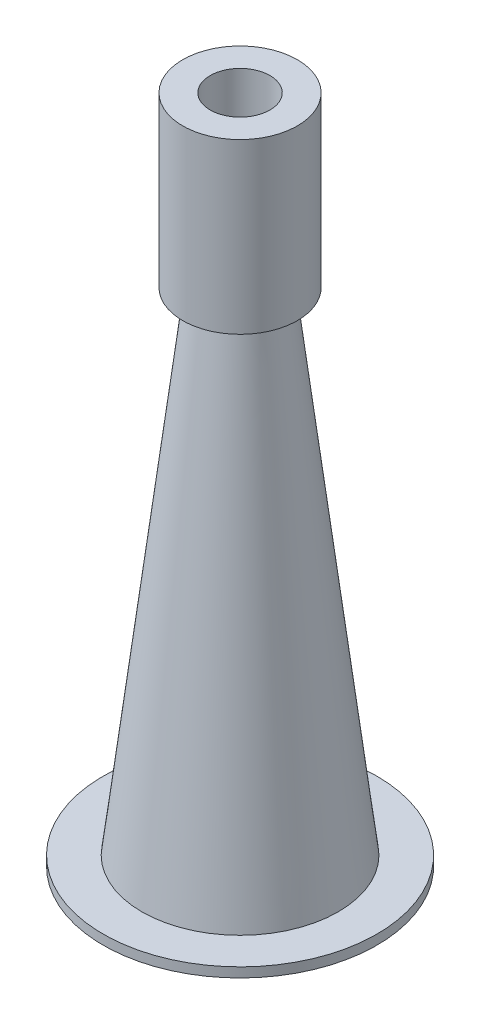
ISO-10303-21;
HEADER;
FILE_DESCRIPTION(('STEP AP214'),'2;1');
FILE_NAME('part.step','',(''),(''),'','','');
FILE_SCHEMA(('AUTOMOTIVE_DESIGN { 1 0 10303 214 1 1 1 1 }'));
ENDSEC;
DATA;
#1=APPLICATION_CONTEXT('core data for automotive mechanical design processes');
#2=APPLICATION_PROTOCOL_DEFINITION('international standard','automotive_design',2000,#1);
#3=PRODUCT_CONTEXT('',#1,'mechanical');
#4=PRODUCT('Part','Part','',(#3));
#5=PRODUCT_RELATED_PRODUCT_CATEGORY('part','',(#4));
#6=PRODUCT_DEFINITION_FORMATION('','',#4);
#7=PRODUCT_DEFINITION_CONTEXT('part definition',#1,'design');
#8=PRODUCT_DEFINITION('design','',#6,#7);
#9=PRODUCT_DEFINITION_SHAPE('','',#8);
#10=(LENGTH_UNIT() NAMED_UNIT(*) SI_UNIT(.MILLI.,.METRE.));
#11=(NAMED_UNIT(*) PLANE_ANGLE_UNIT() SI_UNIT($,.RADIAN.));
#12=(NAMED_UNIT(*) SI_UNIT($,.STERADIAN.) SOLID_ANGLE_UNIT());
#13=UNCERTAINTY_MEASURE_WITH_UNIT(LENGTH_MEASURE(1.E-05),#10,'distance_accuracy_value','');
#14=(GEOMETRIC_REPRESENTATION_CONTEXT(3) GLOBAL_UNCERTAINTY_ASSIGNED_CONTEXT((#13)) GLOBAL_UNIT_ASSIGNED_CONTEXT((#10,
#11,#12)) REPRESENTATION_CONTEXT('',''));
#15=CARTESIAN_POINT('',(0.,0.,0.));
#16=DIRECTION('',(0.,0.,1.));
#17=DIRECTION('',(1.,0.,0.));
#18=AXIS2_PLACEMENT_3D('',#15,#16,#17);
#19=CARTESIAN_POINT('',(0.,0.,0.));
#20=DIRECTION('',(0.,-1.,0.));
#21=DIRECTION('',(0.,0.,-1.));
#22=AXIS2_PLACEMENT_3D('',#19,#20,#21);
#23=CYLINDRICAL_SURFACE('',#22,59.4999999999999);
#24=CARTESIAN_POINT('',(0.,695.,0.));
#25=DIRECTION('',(0.,-1.,0.));
#26=DIRECTION('',(0.,0.,-1.));
#27=AXIS2_PLACEMENT_3D('',#24,#25,#26);
#28=CIRCLE('',#27,59.4999999999999);
#29=CARTESIAN_POINT('',(0.,695.,-59.4999999999999));
#30=VERTEX_POINT('',#29);
#31=EDGE_CURVE('E80',#30,#30,#28,.T.);
#32=ORIENTED_EDGE('',*,*,#31,.T.);
#33=EDGE_LOOP('',(#32));
#34=FACE_BOUND('',#33,.T.);
#35=CARTESIAN_POINT('',(0.,520.,0.));
#36=DIRECTION('',(0.,-1.,0.));
#37=DIRECTION('',(0.,0.,-1.));
#38=AXIS2_PLACEMENT_3D('',#35,#36,#37);
#39=CIRCLE('',#38,59.4999999999999);
#40=CARTESIAN_POINT('',(0.,520.,-59.4999999999999));
#41=VERTEX_POINT('',#40);
#42=EDGE_CURVE('E10',#41,#41,#39,.T.);
#43=ORIENTED_EDGE('',*,*,#42,.F.);
#44=EDGE_LOOP('',(#43));
#45=FACE_BOUND('',#44,.T.);
#46=ADVANCED_FACE('F41',(#34,#45),#23,.T.);
#47=CARTESIAN_POINT('',(59.4999999999999,520.,0.));
#48=DIRECTION('',(0.,-1.,0.));
#49=DIRECTION('',(0.,0.,-1.));
#50=AXIS2_PLACEMENT_3D('',#47,#48,#49);
#51=PLANE('',#50);
#52=ORIENTED_EDGE('',*,*,#42,.T.);
#53=EDGE_LOOP('',(#52));
#54=FACE_BOUND('',#53,.T.);
#55=CARTESIAN_POINT('',(0.,520.,0.));
#56=DIRECTION('',(0.,-1.,0.));
#57=DIRECTION('',(0.,0.,-1.));
#58=AXIS2_PLACEMENT_3D('',#55,#56,#57);
#59=CIRCLE('',#58,40.9999999999999);
#60=CARTESIAN_POINT('',(0.,520.,-40.9999999999999));
#61=VERTEX_POINT('',#60);
#62=EDGE_CURVE('E48',#61,#61,#59,.T.);
#63=ORIENTED_EDGE('',*,*,#62,.F.);
#64=EDGE_LOOP('',(#63));
#65=FACE_BOUND('',#64,.T.);
#66=ADVANCED_FACE('F99',(#54,#65),#51,.T.);
#67=CARTESIAN_POINT('',(0.,9.99999999999999,0.));
#68=DIRECTION('',(0.,-1.,0.));
#69=DIRECTION('',(0.,0.,-1.));
#70=AXIS2_PLACEMENT_3D('',#67,#68,#69);
#71=CONICAL_SURFACE('',#70,101.908326060574,0.118865096838854);
#72=ORIENTED_EDGE('',*,*,#62,.T.);
#73=EDGE_LOOP('',(#72));
#74=FACE_BOUND('',#73,.T.);
#75=CARTESIAN_POINT('',(0.,9.99999999999999,0.));
#76=DIRECTION('',(0.,-1.,0.));
#77=DIRECTION('',(0.,0.,-1.));
#78=AXIS2_PLACEMENT_3D('',#75,#76,#77);
#79=CIRCLE('',#78,101.908326060574);
#80=CARTESIAN_POINT('',(0.,9.99999999999999,-101.908326060574));
#81=VERTEX_POINT('',#80);
#82=EDGE_CURVE('E53',#81,#81,#79,.T.);
#83=ORIENTED_EDGE('',*,*,#82,.F.);
#84=EDGE_LOOP('',(#83));
#85=FACE_BOUND('',#84,.T.);
#86=ADVANCED_FACE('F103',(#74,#85),#71,.T.);
#87=CARTESIAN_POINT('',(142.,10.,0.));
#88=DIRECTION('',(0.,1.,0.));
#89=DIRECTION('',(0.,0.,1.));
#90=AXIS2_PLACEMENT_3D('',#87,#88,#89);
#91=PLANE('',#90);
#92=ORIENTED_EDGE('',*,*,#82,.T.);
#93=EDGE_LOOP('',(#92));
#94=FACE_BOUND('',#93,.T.);
#95=CARTESIAN_POINT('',(0.,10.,0.));
#96=DIRECTION('',(0.,-1.,0.));
#97=DIRECTION('',(0.,0.,-1.));
#98=AXIS2_PLACEMENT_3D('',#95,#96,#97);
#99=CIRCLE('',#98,142.);
#100=CARTESIAN_POINT('',(0.,10.,-142.));
#101=VERTEX_POINT('',#100);
#102=EDGE_CURVE('E58',#101,#101,#99,.T.);
#103=ORIENTED_EDGE('',*,*,#102,.F.);
#104=EDGE_LOOP('',(#103));
#105=FACE_BOUND('',#104,.T.);
#106=ADVANCED_FACE('F107',(#94,#105),#91,.T.);
#107=CARTESIAN_POINT('',(0.,0.,0.));
#108=DIRECTION('',(0.,-1.,0.));
#109=DIRECTION('',(0.,0.,-1.));
#110=AXIS2_PLACEMENT_3D('',#107,#108,#109);
#111=CYLINDRICAL_SURFACE('',#110,142.);
#112=ORIENTED_EDGE('',*,*,#102,.T.);
#113=EDGE_LOOP('',(#112));
#114=FACE_BOUND('',#113,.T.);
#115=CARTESIAN_POINT('',(0.,0.,0.));
#116=DIRECTION('',(0.,-1.,0.));
#117=DIRECTION('',(0.,0.,-1.));
#118=AXIS2_PLACEMENT_3D('',#115,#116,#117);
#119=CIRCLE('',#118,142.);
#120=CARTESIAN_POINT('',(0.,0.,-142.));
#121=VERTEX_POINT('',#120);
#122=EDGE_CURVE('E64',#121,#121,#119,.T.);
#123=ORIENTED_EDGE('',*,*,#122,.F.);
#124=EDGE_LOOP('',(#123));
#125=FACE_BOUND('',#124,.T.);
#126=ADVANCED_FACE('F113',(#114,#125),#111,.T.);
#127=CARTESIAN_POINT('',(95.,0.,0.));
#128=DIRECTION('',(0.,-1.,0.));
#129=DIRECTION('',(0.,0.,-1.));
#130=AXIS2_PLACEMENT_3D('',#127,#128,#129);
#131=PLANE('',#130);
#132=ORIENTED_EDGE('',*,*,#122,.T.);
#133=EDGE_LOOP('',(#132));
#134=FACE_BOUND('',#133,.T.);
#135=CARTESIAN_POINT('',(0.,0.,0.));
#136=DIRECTION('',(0.,-1.,0.));
#137=DIRECTION('',(0.,0.,-1.));
#138=AXIS2_PLACEMENT_3D('',#135,#136,#137);
#139=CIRCLE('',#138,95.);
#140=CARTESIAN_POINT('',(0.,0.,-95.));
#141=VERTEX_POINT('',#140);
#142=EDGE_CURVE('E68',#141,#141,#139,.T.);
#143=ORIENTED_EDGE('',*,*,#142,.F.);
#144=EDGE_LOOP('',(#143));
#145=FACE_BOUND('',#144,.T.);
#146=ADVANCED_FACE('F117',(#134,#145),#131,.T.);
#147=CARTESIAN_POINT('',(0.,520.,0.));
#148=DIRECTION('',(0.,-1.,0.));
#149=DIRECTION('',(0.,0.,-1.));
#150=AXIS2_PLACEMENT_3D('',#147,#148,#149);
#151=CONICAL_SURFACE('',#150,30.9999999999999,0.122461057417342);
#152=CARTESIAN_POINT('',(0.,520.,0.));
#153=DIRECTION('',(0.,-1.,0.));
#154=DIRECTION('',(0.,0.,-1.));
#155=AXIS2_PLACEMENT_3D('',#152,#153,#154);
#156=CIRCLE('',#155,30.9999999999999);
#157=CARTESIAN_POINT('',(0.,520.,-30.9999999999999));
#158=VERTEX_POINT('',#157);
#159=EDGE_CURVE('E72',#158,#158,#156,.T.);
#160=CARTESIAN_POINT('',(0.,0.,-95.));
#161=CARTESIAN_POINT('',(0.,5.41666666666667,-94.3333333333334));
#162=CARTESIAN_POINT('',(0.,10.8333333333333,-93.6666666666667));
#163=CARTESIAN_POINT('',(0.,21.6666666666667,-92.3333333333334));
#164=CARTESIAN_POINT('',(0.,27.0833333333333,-91.6666666666667));
#165=CARTESIAN_POINT('',(0.,37.9166666666667,-90.3333333333334));
#166=CARTESIAN_POINT('',(0.,43.3333333333334,-89.6666666666667));
#167=CARTESIAN_POINT('',(0.,54.1666666666667,-88.3333333333334));
#168=CARTESIAN_POINT('',(0.,59.5833333333333,-87.6666666666667));
#169=CARTESIAN_POINT('',(0.,70.4166666666667,-86.3333333333333));
#170=CARTESIAN_POINT('',(0.,75.8333333333334,-85.6666666666667));
#171=CARTESIAN_POINT('',(0.,86.6666666666667,-84.3333333333333));
#172=CARTESIAN_POINT('',(0.,92.0833333333334,-83.6666666666667));
#173=CARTESIAN_POINT('',(0.,102.916666666667,-82.3333333333334));
#174=CARTESIAN_POINT('',(0.,108.333333333333,-81.6666666666667));
#175=CARTESIAN_POINT('',(0.,119.166666666667,-80.3333333333334));
#176=CARTESIAN_POINT('',(0.,124.583333333333,-79.6666666666667));
#177=CARTESIAN_POINT('',(0.,135.416666666667,-78.3333333333333));
#178=CARTESIAN_POINT('',(0.,140.833333333333,-77.6666666666667));
#179=CARTESIAN_POINT('',(0.,151.666666666667,-76.3333333333333));
#180=CARTESIAN_POINT('',(0.,157.083333333333,-75.6666666666667));
#181=CARTESIAN_POINT('',(0.,167.916666666667,-74.3333333333333));
#182=CARTESIAN_POINT('',(0.,173.333333333333,-73.6666666666667));
#183=CARTESIAN_POINT('',(0.,184.166666666667,-72.3333333333333));
#184=CARTESIAN_POINT('',(0.,189.583333333333,-71.6666666666666));
#185=CARTESIAN_POINT('',(0.,200.416666666667,-70.3333333333333));
#186=CARTESIAN_POINT('',(0.,205.833333333333,-69.6666666666666));
#187=CARTESIAN_POINT('',(0.,216.666666666667,-68.3333333333333));
#188=CARTESIAN_POINT('',(0.,222.083333333333,-67.6666666666666));
#189=CARTESIAN_POINT('',(0.,232.916666666667,-66.3333333333333));
#190=CARTESIAN_POINT('',(0.,238.333333333333,-65.6666666666666));
#191=CARTESIAN_POINT('',(0.,249.166666666667,-64.3333333333333));
#192=CARTESIAN_POINT('',(0.,254.583333333333,-63.6666666666666));
#193=CARTESIAN_POINT('',(0.,265.416666666667,-62.3333333333333));
#194=CARTESIAN_POINT('',(0.,270.833333333333,-61.6666666666666));
#195=CARTESIAN_POINT('',(0.,281.666666666667,-60.3333333333333));
#196=CARTESIAN_POINT('',(0.,287.083333333333,-59.6666666666666));
#197=CARTESIAN_POINT('',(0.,297.916666666667,-58.3333333333333));
#198=CARTESIAN_POINT('',(0.,303.333333333333,-57.6666666666666));
#199=CARTESIAN_POINT('',(0.,314.166666666667,-56.3333333333333));
#200=CARTESIAN_POINT('',(0.,319.583333333333,-55.6666666666666));
#201=CARTESIAN_POINT('',(0.,330.416666666667,-54.3333333333333));
#202=CARTESIAN_POINT('',(0.,335.833333333333,-53.6666666666666));
#203=CARTESIAN_POINT('',(0.,346.666666666667,-52.3333333333333));
#204=CARTESIAN_POINT('',(0.,352.083333333333,-51.6666666666666));
#205=CARTESIAN_POINT('',(0.,362.916666666667,-50.3333333333333));
#206=CARTESIAN_POINT('',(0.,368.333333333333,-49.6666666666666));
#207=CARTESIAN_POINT('',(0.,379.166666666667,-48.3333333333333));
#208=CARTESIAN_POINT('',(0.,384.583333333333,-47.6666666666666));
#209=CARTESIAN_POINT('',(0.,395.416666666667,-46.3333333333333));
#210=CARTESIAN_POINT('',(0.,400.833333333333,-45.6666666666666));
#211=CARTESIAN_POINT('',(0.,411.666666666667,-44.3333333333333));
#212=CARTESIAN_POINT('',(0.,417.083333333333,-43.6666666666666));
#213=CARTESIAN_POINT('',(0.,427.916666666667,-42.3333333333333));
#214=CARTESIAN_POINT('',(0.,433.333333333333,-41.6666666666666));
#215=CARTESIAN_POINT('',(0.,444.166666666667,-40.3333333333333));
#216=CARTESIAN_POINT('',(0.,449.583333333333,-39.6666666666666));
#217=CARTESIAN_POINT('',(0.,460.416666666667,-38.3333333333333));
#218=CARTESIAN_POINT('',(0.,465.833333333333,-37.6666666666666));
#219=CARTESIAN_POINT('',(0.,476.666666666667,-36.3333333333333));
#220=CARTESIAN_POINT('',(0.,482.083333333333,-35.6666666666666));
#221=CARTESIAN_POINT('',(0.,492.916666666667,-34.3333333333333));
#222=CARTESIAN_POINT('',(0.,498.333333333333,-33.6666666666666));
#223=CARTESIAN_POINT('',(0.,509.166666666667,-32.3333333333333));
#224=CARTESIAN_POINT('',(0.,514.583333333333,-31.6666666666666));
#225=CARTESIAN_POINT('',(0.,520.,-30.9999999999999));
#226=B_SPLINE_CURVE_WITH_KNOTS('',3,(#160,#161,#162,#163,#164,#165,#166,#167,#168,#169,#170,
#171,#172,#173,#174,#175,#176,#177,#178,#179,#180,#181,#182,#183,#184,#185,#186,#187,#188,#189,
#190,#191,#192,#193,#194,#195,#196,#197,#198,#199,#200,#201,#202,#203,#204,#205,#206,#207,#208,
#209,#210,#211,#212,#213,#214,#215,#216,#217,#218,#219,#220,#221,#222,#223,#224,#225),
.UNSPECIFIED.,.F.,.F.,(4,2,2,2,2,2,2,2,2,2,2,2,2,2,2,2,2,2,2,2,2,2,2,2,2,2,2,2,2,2,2,2,4),(0.,
16.3726143300329,32.7452286600659,49.1178429900988,65.4904573201318,81.8630716501647,
98.2356859801977,114.608300310231,130.980914640264,147.353528970296,163.726143300329,
180.098757630362,196.471371960395,212.843986290428,229.216600620461,245.589214950494,
261.961829280527,278.33444361056,294.707057940593,311.079672270626,327.452286600659,
343.824900930692,360.197515260725,376.570129590758,392.942743920791,409.315358250824,
425.687972580856,442.060586910889,458.433201240922,474.805815570955,491.178429900988,
507.551044231021,523.923658561054),.UNSPECIFIED.);
#227=EDGE_CURVE('BSEAM95',#141,#158,#226,.T.);
#228=ORIENTED_EDGE('',*,*,#142,.T.);
#229=ORIENTED_EDGE('',*,*,#159,.F.);
#230=ORIENTED_EDGE('',*,*,#227,.T.);
#231=ORIENTED_EDGE('',*,*,#227,.F.);
#232=EDGE_LOOP('',(#228,#230,#229,#231));
#233=FACE_BOUND('',#232,.T.);
#234=ADVANCED_FACE('F95',(#233),#151,.F.);
#235=CARTESIAN_POINT('',(0.,0.,0.));
#236=DIRECTION('',(0.,-1.,0.));
#237=DIRECTION('',(0.,0.,-1.));
#238=AXIS2_PLACEMENT_3D('',#235,#236,#237);
#239=CYLINDRICAL_SURFACE('',#238,30.9999999999999);
#240=ORIENTED_EDGE('',*,*,#159,.T.);
#241=EDGE_LOOP('',(#240));
#242=FACE_BOUND('',#241,.T.);
#243=CARTESIAN_POINT('',(0.,695.,0.));
#244=DIRECTION('',(0.,-1.,0.));
#245=DIRECTION('',(0.,0.,-1.));
#246=AXIS2_PLACEMENT_3D('',#243,#244,#245);
#247=CIRCLE('',#246,30.9999999999999);
#248=CARTESIAN_POINT('',(0.,695.,-30.9999999999999));
#249=VERTEX_POINT('',#248);
#250=EDGE_CURVE('E76',#249,#249,#247,.T.);
#251=ORIENTED_EDGE('',*,*,#250,.F.);
#252=EDGE_LOOP('',(#251));
#253=FACE_BOUND('',#252,.T.);
#254=ADVANCED_FACE('F89',(#242,#253),#239,.F.);
#255=CARTESIAN_POINT('',(30.9999999999999,695.,0.));
#256=DIRECTION('',(0.,1.,0.));
#257=DIRECTION('',(0.,0.,1.));
#258=AXIS2_PLACEMENT_3D('',#255,#256,#257);
#259=PLANE('',#258);
#260=ORIENTED_EDGE('',*,*,#250,.T.);
#261=EDGE_LOOP('',(#260));
#262=FACE_BOUND('',#261,.T.);
#263=ORIENTED_EDGE('',*,*,#31,.F.);
#264=EDGE_LOOP('',(#263));
#265=FACE_BOUND('',#264,.T.);
#266=ADVANCED_FACE('F87',(#262,#265),#259,.T.);
#267=CLOSED_SHELL('',(#46,#66,#86,#106,#126,#146,#234,#254,#266));
#268=MANIFOLD_SOLID_BREP('B2',#267);
#269=ADVANCED_BREP_SHAPE_REPRESENTATION('',(#18,#268),#14);
#270=SHAPE_DEFINITION_REPRESENTATION(#9,#269);
ENDSEC;
END-ISO-10303-21;
